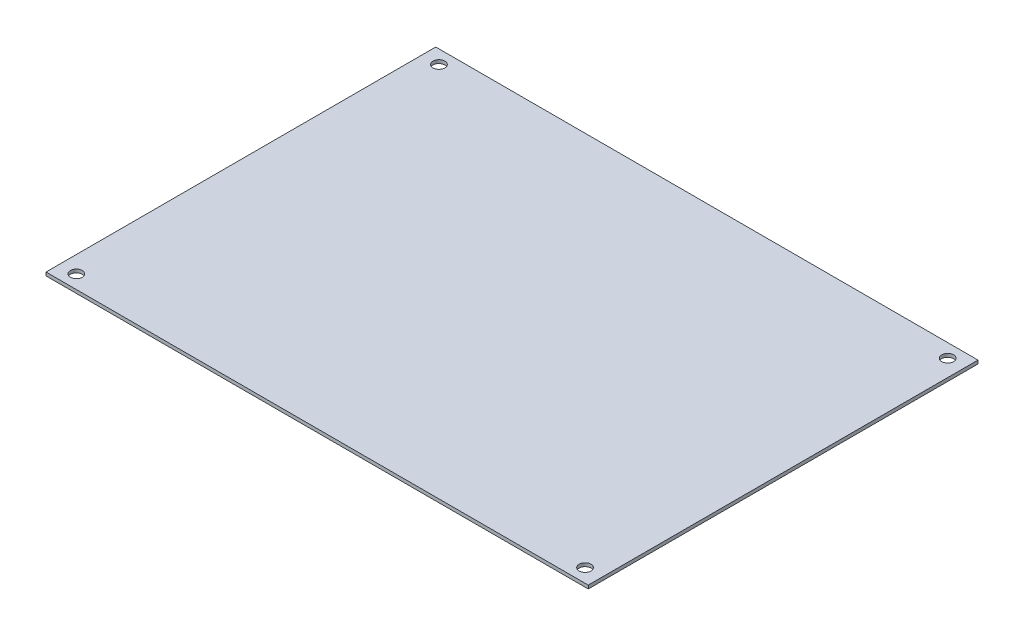
ISO-10303-21;
HEADER;
FILE_DESCRIPTION(('STEP AP214'),'2;1');
FILE_NAME('part.step','',(''),(''),'','','');
FILE_SCHEMA(('AUTOMOTIVE_DESIGN { 1 0 10303 214 1 1 1 1 }'));
ENDSEC;
DATA;
#1=APPLICATION_CONTEXT('core data for automotive mechanical design processes');
#2=APPLICATION_PROTOCOL_DEFINITION('international standard','automotive_design',2000,#1);
#3=PRODUCT_CONTEXT('',#1,'mechanical');
#4=PRODUCT('Part','Part','',(#3));
#5=PRODUCT_RELATED_PRODUCT_CATEGORY('part','',(#4));
#6=PRODUCT_DEFINITION_FORMATION('','',#4);
#7=PRODUCT_DEFINITION_CONTEXT('part definition',#1,'design');
#8=PRODUCT_DEFINITION('design','',#6,#7);
#9=PRODUCT_DEFINITION_SHAPE('','',#8);
#10=(LENGTH_UNIT() NAMED_UNIT(*) SI_UNIT(.MILLI.,.METRE.));
#11=(NAMED_UNIT(*) PLANE_ANGLE_UNIT() SI_UNIT($,.RADIAN.));
#12=(NAMED_UNIT(*) SI_UNIT($,.STERADIAN.) SOLID_ANGLE_UNIT());
#13=UNCERTAINTY_MEASURE_WITH_UNIT(LENGTH_MEASURE(1.E-05),#10,'distance_accuracy_value','');
#14=(GEOMETRIC_REPRESENTATION_CONTEXT(3) GLOBAL_UNCERTAINTY_ASSIGNED_CONTEXT((#13)) GLOBAL_UNIT_ASSIGNED_CONTEXT((#10,
#11,#12)) REPRESENTATION_CONTEXT('',''));
#15=CARTESIAN_POINT('',(0.,0.,0.));
#16=DIRECTION('',(0.,0.,1.));
#17=DIRECTION('',(1.,0.,0.));
#18=AXIS2_PLACEMENT_3D('',#15,#16,#17);
#19=CARTESIAN_POINT('',(-66.9000648882147,1.,-58.025566484676));
#20=DIRECTION('',(1.,0.,0.));
#21=DIRECTION('',(0.,0.,-1.));
#22=AXIS2_PLACEMENT_3D('',#19,#20,#21);
#23=PLANE('',#22);
#24=DIRECTION('',(0.,0.,1.));
#25=VECTOR('',#24,1.);
#26=CARTESIAN_POINT('',(-66.9000648882147,0.,-58.025566484676));
#27=LINE('',#26,#25);
#28=CARTESIAN_POINT('',(-66.9000648882147,0.,-58.025566484676));
#29=VERTEX_POINT('',#28);
#30=CARTESIAN_POINT('',(-66.9000648882147,0.,56.974433515324));
#31=VERTEX_POINT('',#30);
#32=EDGE_CURVE('E96',#29,#31,#27,.T.);
#33=ORIENTED_EDGE('',*,*,#32,.T.);
#34=DIRECTION('',(0.,-1.,0.));
#35=VECTOR('',#34,1.);
#36=CARTESIAN_POINT('',(-66.9000648882147,1.,56.974433515324));
#37=LINE('',#36,#35);
#38=CARTESIAN_POINT('',(-66.9000648882147,1.,56.974433515324));
#39=VERTEX_POINT('',#38);
#40=EDGE_CURVE('E11',#39,#31,#37,.T.);
#41=ORIENTED_EDGE('',*,*,#40,.F.);
#42=DIRECTION('',(0.,0.,1.));
#43=VECTOR('',#42,1.);
#44=CARTESIAN_POINT('',(-66.9000648882147,1.,-58.025566484676));
#45=LINE('',#44,#43);
#46=CARTESIAN_POINT('',(-66.9000648882147,1.,-58.025566484676));
#47=VERTEX_POINT('',#46);
#48=EDGE_CURVE('E84',#47,#39,#45,.T.);
#49=ORIENTED_EDGE('',*,*,#48,.F.);
#50=DIRECTION('',(0.,-1.,0.));
#51=VECTOR('',#50,1.);
#52=CARTESIAN_POINT('',(-66.9000648882147,1.,-58.025566484676));
#53=LINE('',#52,#51);
#54=EDGE_CURVE('E92',#47,#29,#53,.T.);
#55=ORIENTED_EDGE('',*,*,#54,.T.);
#56=EDGE_LOOP('',(#33,#41,#49,#55));
#57=FACE_BOUND('',#56,.T.);
#58=ADVANCED_FACE('F33',(#57),#23,.F.);
#59=CARTESIAN_POINT('',(-66.9000648882147,1.,56.974433515324));
#60=DIRECTION('',(0.,0.,-1.));
#61=DIRECTION('',(-1.,0.,0.));
#62=AXIS2_PLACEMENT_3D('',#59,#60,#61);
#63=PLANE('',#62);
#64=DIRECTION('',(1.,0.,0.));
#65=VECTOR('',#64,1.);
#66=CARTESIAN_POINT('',(-66.9000648882147,0.,56.974433515324));
#67=LINE('',#66,#65);
#68=CARTESIAN_POINT('',(93.0999351117853,0.,56.974433515324));
#69=VERTEX_POINT('',#68);
#70=EDGE_CURVE('E88',#31,#69,#67,.T.);
#71=ORIENTED_EDGE('',*,*,#70,.T.);
#72=DIRECTION('',(0.,-1.,0.));
#73=VECTOR('',#72,1.);
#74=CARTESIAN_POINT('',(93.0999351117853,1.,56.974433515324));
#75=LINE('',#74,#73);
#76=CARTESIAN_POINT('',(93.0999351117853,1.,56.974433515324));
#77=VERTEX_POINT('',#76);
#78=EDGE_CURVE('E41',#77,#69,#75,.T.);
#79=ORIENTED_EDGE('',*,*,#78,.F.);
#80=DIRECTION('',(1.,0.,0.));
#81=VECTOR('',#80,1.);
#82=CARTESIAN_POINT('',(-66.9000648882147,1.,56.974433515324));
#83=LINE('',#82,#81);
#84=EDGE_CURVE('E79',#39,#77,#83,.T.);
#85=ORIENTED_EDGE('',*,*,#84,.F.);
#86=ORIENTED_EDGE('',*,*,#40,.T.);
#87=EDGE_LOOP('',(#71,#79,#85,#86));
#88=FACE_BOUND('',#87,.T.);
#89=ADVANCED_FACE('F87',(#88),#63,.F.);
#90=CARTESIAN_POINT('',(93.0999351117853,1.,-58.025566484676));
#91=DIRECTION('',(-1.,0.,0.));
#92=DIRECTION('',(0.,0.,1.));
#93=AXIS2_PLACEMENT_3D('',#90,#91,#92);
#94=PLANE('',#93);
#95=DIRECTION('',(0.,0.,-1.));
#96=VECTOR('',#95,1.);
#97=CARTESIAN_POINT('',(93.0999351117853,0.,-58.025566484676));
#98=LINE('',#97,#96);
#99=CARTESIAN_POINT('',(93.0999351117853,0.,-58.025566484676));
#100=VERTEX_POINT('',#99);
#101=EDGE_CURVE('E66',#69,#100,#98,.T.);
#102=ORIENTED_EDGE('',*,*,#101,.T.);
#103=DIRECTION('',(0.,-1.,0.));
#104=VECTOR('',#103,1.);
#105=CARTESIAN_POINT('',(93.0999351117853,1.,-58.025566484676));
#106=LINE('',#105,#104);
#107=CARTESIAN_POINT('',(93.0999351117853,1.,-58.025566484676));
#108=VERTEX_POINT('',#107);
#109=EDGE_CURVE('E89',#108,#100,#106,.T.);
#110=ORIENTED_EDGE('',*,*,#109,.F.);
#111=DIRECTION('',(0.,0.,-1.));
#112=VECTOR('',#111,1.);
#113=CARTESIAN_POINT('',(93.0999351117853,1.,-58.025566484676));
#114=LINE('',#113,#112);
#115=EDGE_CURVE('E82',#77,#108,#114,.T.);
#116=ORIENTED_EDGE('',*,*,#115,.F.);
#117=ORIENTED_EDGE('',*,*,#78,.T.);
#118=EDGE_LOOP('',(#102,#110,#116,#117));
#119=FACE_BOUND('',#118,.T.);
#120=ADVANCED_FACE('F90',(#119),#94,.F.);
#121=CARTESIAN_POINT('',(-66.9000648882147,1.,-58.025566484676));
#122=DIRECTION('',(0.,0.,1.));
#123=DIRECTION('',(1.,0.,0.));
#124=AXIS2_PLACEMENT_3D('',#121,#122,#123);
#125=PLANE('',#124);
#126=DIRECTION('',(-1.,0.,0.));
#127=VECTOR('',#126,1.);
#128=CARTESIAN_POINT('',(-66.9000648882147,0.,-58.025566484676));
#129=LINE('',#128,#127);
#130=EDGE_CURVE('E72',#100,#29,#129,.T.);
#131=ORIENTED_EDGE('',*,*,#130,.T.);
#132=ORIENTED_EDGE('',*,*,#54,.F.);
#133=DIRECTION('',(-1.,0.,0.));
#134=VECTOR('',#133,1.);
#135=CARTESIAN_POINT('',(-66.9000648882147,1.,-58.025566484676));
#136=LINE('',#135,#134);
#137=EDGE_CURVE('E49',#108,#47,#136,.T.);
#138=ORIENTED_EDGE('',*,*,#137,.F.);
#139=ORIENTED_EDGE('',*,*,#109,.T.);
#140=EDGE_LOOP('',(#131,#132,#138,#139));
#141=FACE_BOUND('',#140,.T.);
#142=ADVANCED_FACE('F104',(#141),#125,.F.);
#143=CARTESIAN_POINT('',(0.,1.,0.));
#144=DIRECTION('',(0.,1.,0.));
#145=DIRECTION('',(0.,0.,1.));
#146=AXIS2_PLACEMENT_3D('',#143,#144,#145);
#147=PLANE('',#146);
#148=CARTESIAN_POINT('',(88.1549351117853,1.,-54.025566484676));
#149=DIRECTION('',(0.,1.,0.));
#150=DIRECTION('',(0.,0.,1.));
#151=AXIS2_PLACEMENT_3D('',#148,#149,#150);
#152=CIRCLE('',#151,1.75);
#153=CARTESIAN_POINT('',(88.1549351117853,1.,-52.275566484676));
#154=VERTEX_POINT('',#153);
#155=EDGE_CURVE('E128',#154,#154,#152,.T.);
#156=ORIENTED_EDGE('',*,*,#155,.F.);
#157=EDGE_LOOP('',(#156));
#158=FACE_BOUND('',#157,.T.);
#159=CARTESIAN_POINT('',(88.1549351117853,1.,52.974433515324));
#160=DIRECTION('',(0.,1.,0.));
#161=DIRECTION('',(0.,0.,1.));
#162=AXIS2_PLACEMENT_3D('',#159,#160,#161);
#163=CIRCLE('',#162,1.75);
#164=CARTESIAN_POINT('',(88.1549351117853,1.,54.724433515324));
#165=VERTEX_POINT('',#164);
#166=EDGE_CURVE('E122',#165,#165,#163,.T.);
#167=ORIENTED_EDGE('',*,*,#166,.F.);
#168=EDGE_LOOP('',(#167));
#169=FACE_BOUND('',#168,.T.);
#170=CARTESIAN_POINT('',(-61.9550648882147,1.,-54.025566484676));
#171=DIRECTION('',(0.,1.,0.));
#172=DIRECTION('',(0.,0.,1.));
#173=AXIS2_PLACEMENT_3D('',#170,#171,#172);
#174=CIRCLE('',#173,1.75);
#175=CARTESIAN_POINT('',(-61.9550648882147,1.,-52.275566484676));
#176=VERTEX_POINT('',#175);
#177=EDGE_CURVE('E116',#176,#176,#174,.T.);
#178=ORIENTED_EDGE('',*,*,#177,.F.);
#179=EDGE_LOOP('',(#178));
#180=FACE_BOUND('',#179,.T.);
#181=CARTESIAN_POINT('',(-61.9550648882147,1.,52.974433515324));
#182=DIRECTION('',(0.,1.,0.));
#183=DIRECTION('',(0.,0.,1.));
#184=AXIS2_PLACEMENT_3D('',#181,#182,#183);
#185=CIRCLE('',#184,1.75);
#186=CARTESIAN_POINT('',(-61.9550648882147,1.,54.724433515324));
#187=VERTEX_POINT('',#186);
#188=EDGE_CURVE('E110',#187,#187,#185,.T.);
#189=ORIENTED_EDGE('',*,*,#188,.F.);
#190=EDGE_LOOP('',(#189));
#191=FACE_BOUND('',#190,.T.);
#192=ORIENTED_EDGE('',*,*,#48,.T.);
#193=ORIENTED_EDGE('',*,*,#84,.T.);
#194=ORIENTED_EDGE('',*,*,#115,.T.);
#195=ORIENTED_EDGE('',*,*,#137,.T.);
#196=EDGE_LOOP('',(#192,#193,#194,#195));
#197=FACE_BOUND('',#196,.T.);
#198=ADVANCED_FACE('F80',(#158,#169,#180,#191,#197),#147,.T.);
#199=CARTESIAN_POINT('',(0.,0.,0.));
#200=DIRECTION('',(0.,1.,0.));
#201=DIRECTION('',(0.,0.,1.));
#202=AXIS2_PLACEMENT_3D('',#199,#200,#201);
#203=PLANE('',#202);
#204=CARTESIAN_POINT('',(88.1549351117853,0.,-54.025566484676));
#205=DIRECTION('',(0.,1.,0.));
#206=DIRECTION('',(0.,0.,1.));
#207=AXIS2_PLACEMENT_3D('',#204,#205,#206);
#208=CIRCLE('',#207,1.75);
#209=CARTESIAN_POINT('',(88.1549351117853,0.,-52.275566484676));
#210=VERTEX_POINT('',#209);
#211=EDGE_CURVE('E125',#210,#210,#208,.T.);
#212=ORIENTED_EDGE('',*,*,#211,.T.);
#213=EDGE_LOOP('',(#212));
#214=FACE_BOUND('',#213,.T.);
#215=CARTESIAN_POINT('',(88.1549351117853,0.,52.974433515324));
#216=DIRECTION('',(0.,1.,0.));
#217=DIRECTION('',(0.,0.,1.));
#218=AXIS2_PLACEMENT_3D('',#215,#216,#217);
#219=CIRCLE('',#218,1.75);
#220=CARTESIAN_POINT('',(88.1549351117853,0.,54.724433515324));
#221=VERTEX_POINT('',#220);
#222=EDGE_CURVE('E119',#221,#221,#219,.T.);
#223=ORIENTED_EDGE('',*,*,#222,.T.);
#224=EDGE_LOOP('',(#223));
#225=FACE_BOUND('',#224,.T.);
#226=CARTESIAN_POINT('',(-61.9550648882147,0.,-54.025566484676));
#227=DIRECTION('',(0.,1.,0.));
#228=DIRECTION('',(0.,0.,1.));
#229=AXIS2_PLACEMENT_3D('',#226,#227,#228);
#230=CIRCLE('',#229,1.75);
#231=CARTESIAN_POINT('',(-61.9550648882147,0.,-52.275566484676));
#232=VERTEX_POINT('',#231);
#233=EDGE_CURVE('E113',#232,#232,#230,.T.);
#234=ORIENTED_EDGE('',*,*,#233,.T.);
#235=EDGE_LOOP('',(#234));
#236=FACE_BOUND('',#235,.T.);
#237=CARTESIAN_POINT('',(-61.9550648882147,0.,52.974433515324));
#238=DIRECTION('',(0.,1.,0.));
#239=DIRECTION('',(0.,0.,1.));
#240=AXIS2_PLACEMENT_3D('',#237,#238,#239);
#241=CIRCLE('',#240,1.75);
#242=CARTESIAN_POINT('',(-61.9550648882147,0.,54.724433515324));
#243=VERTEX_POINT('',#242);
#244=EDGE_CURVE('E99',#243,#243,#241,.T.);
#245=ORIENTED_EDGE('',*,*,#244,.T.);
#246=EDGE_LOOP('',(#245));
#247=FACE_BOUND('',#246,.T.);
#248=ORIENTED_EDGE('',*,*,#32,.F.);
#249=ORIENTED_EDGE('',*,*,#130,.F.);
#250=ORIENTED_EDGE('',*,*,#101,.F.);
#251=ORIENTED_EDGE('',*,*,#70,.F.);
#252=EDGE_LOOP('',(#248,#249,#250,#251));
#253=FACE_BOUND('',#252,.T.);
#254=ADVANCED_FACE('F107',(#214,#225,#236,#247,#253),#203,.F.);
#255=CARTESIAN_POINT('',(-61.9550648882147,0.,52.974433515324));
#256=DIRECTION('',(0.,1.,0.));
#257=DIRECTION('',(0.,0.,1.));
#258=AXIS2_PLACEMENT_3D('',#255,#256,#257);
#259=CYLINDRICAL_SURFACE('',#258,1.75);
#260=ORIENTED_EDGE('',*,*,#244,.F.);
#261=EDGE_LOOP('',(#260));
#262=FACE_BOUND('',#261,.T.);
#263=ORIENTED_EDGE('',*,*,#188,.T.);
#264=EDGE_LOOP('',(#263));
#265=FACE_BOUND('',#264,.T.);
#266=ADVANCED_FACE('F152',(#262,#265),#259,.F.);
#267=CARTESIAN_POINT('',(-61.9550648882147,0.,-54.025566484676));
#268=DIRECTION('',(0.,1.,0.));
#269=DIRECTION('',(0.,0.,1.));
#270=AXIS2_PLACEMENT_3D('',#267,#268,#269);
#271=CYLINDRICAL_SURFACE('',#270,1.75);
#272=ORIENTED_EDGE('',*,*,#233,.F.);
#273=EDGE_LOOP('',(#272));
#274=FACE_BOUND('',#273,.T.);
#275=ORIENTED_EDGE('',*,*,#177,.T.);
#276=EDGE_LOOP('',(#275));
#277=FACE_BOUND('',#276,.T.);
#278=ADVANCED_FACE('F154',(#274,#277),#271,.F.);
#279=CARTESIAN_POINT('',(88.1549351117853,0.,52.974433515324));
#280=DIRECTION('',(0.,1.,0.));
#281=DIRECTION('',(0.,0.,1.));
#282=AXIS2_PLACEMENT_3D('',#279,#280,#281);
#283=CYLINDRICAL_SURFACE('',#282,1.75);
#284=ORIENTED_EDGE('',*,*,#222,.F.);
#285=EDGE_LOOP('',(#284));
#286=FACE_BOUND('',#285,.T.);
#287=ORIENTED_EDGE('',*,*,#166,.T.);
#288=EDGE_LOOP('',(#287));
#289=FACE_BOUND('',#288,.T.);
#290=ADVANCED_FACE('F139',(#286,#289),#283,.F.);
#291=CARTESIAN_POINT('',(88.1549351117853,0.,-54.025566484676));
#292=DIRECTION('',(0.,1.,0.));
#293=DIRECTION('',(0.,0.,1.));
#294=AXIS2_PLACEMENT_3D('',#291,#292,#293);
#295=CYLINDRICAL_SURFACE('',#294,1.75);
#296=ORIENTED_EDGE('',*,*,#211,.F.);
#297=EDGE_LOOP('',(#296));
#298=FACE_BOUND('',#297,.T.);
#299=ORIENTED_EDGE('',*,*,#155,.T.);
#300=EDGE_LOOP('',(#299));
#301=FACE_BOUND('',#300,.T.);
#302=ADVANCED_FACE('F136',(#298,#301),#295,.F.);
#303=CLOSED_SHELL('',(#58,#89,#120,#142,#198,#254,#266,#278,#290,#302));
#304=MANIFOLD_SOLID_BREP('B2',#303);
#305=ADVANCED_BREP_SHAPE_REPRESENTATION('',(#18,#304),#14);
#306=SHAPE_DEFINITION_REPRESENTATION(#9,#305);
ENDSEC;
END-ISO-10303-21;
